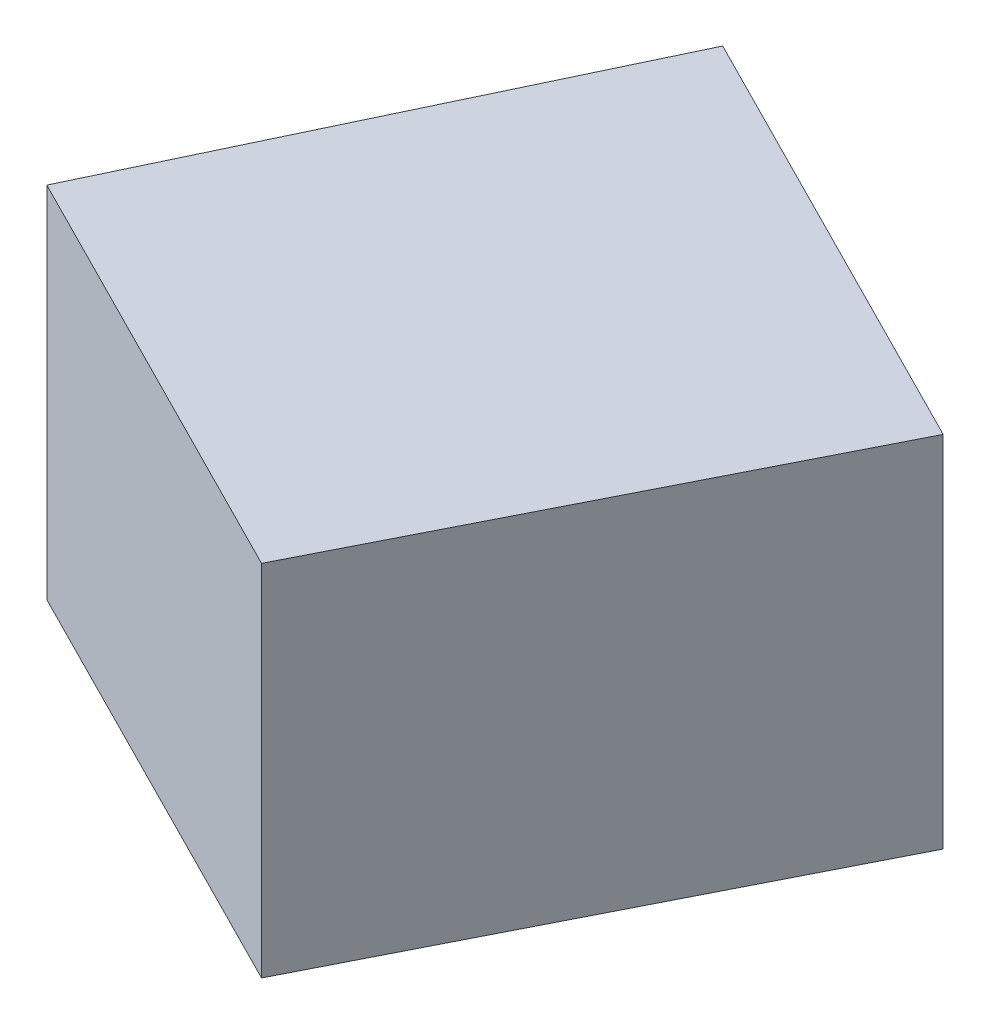
ISO-10303-21;
HEADER;
FILE_DESCRIPTION(('STEP AP214'),'2;1');
FILE_NAME('part.step','',(''),(''),'','','');
FILE_SCHEMA(('AUTOMOTIVE_DESIGN { 1 0 10303 214 1 1 1 1 }'));
ENDSEC;
DATA;
#1=APPLICATION_CONTEXT('core data for automotive mechanical design processes');
#2=APPLICATION_PROTOCOL_DEFINITION('international standard','automotive_design',2000,#1);
#3=PRODUCT_CONTEXT('',#1,'mechanical');
#4=PRODUCT('Part','Part','',(#3));
#5=PRODUCT_RELATED_PRODUCT_CATEGORY('part','',(#4));
#6=PRODUCT_DEFINITION_FORMATION('','',#4);
#7=PRODUCT_DEFINITION_CONTEXT('part definition',#1,'design');
#8=PRODUCT_DEFINITION('design','',#6,#7);
#9=PRODUCT_DEFINITION_SHAPE('','',#8);
#10=(LENGTH_UNIT() NAMED_UNIT(*) SI_UNIT(.MILLI.,.METRE.));
#11=(NAMED_UNIT(*) PLANE_ANGLE_UNIT() SI_UNIT($,.RADIAN.));
#12=(NAMED_UNIT(*) SI_UNIT($,.STERADIAN.) SOLID_ANGLE_UNIT());
#13=UNCERTAINTY_MEASURE_WITH_UNIT(LENGTH_MEASURE(1.E-05),#10,'distance_accuracy_value','');
#14=(GEOMETRIC_REPRESENTATION_CONTEXT(3) GLOBAL_UNCERTAINTY_ASSIGNED_CONTEXT((#13)) GLOBAL_UNIT_ASSIGNED_CONTEXT((#10,
#11,#12)) REPRESENTATION_CONTEXT('',''));
#15=CARTESIAN_POINT('',(0.,0.,0.));
#16=DIRECTION('',(0.,0.,1.));
#17=DIRECTION('',(1.,0.,0.));
#18=AXIS2_PLACEMENT_3D('',#15,#16,#17);
#19=CARTESIAN_POINT('',(-26.5347528052394,57.,-65.485903040052));
#20=DIRECTION('',(0.903480360145151,0.,0.428629488990186));
#21=DIRECTION('',(0.428629488990186,0.,-0.903480360145151));
#22=AXIS2_PLACEMENT_3D('',#19,#20,#21);
#23=PLANE('',#22);
#24=DIRECTION('',(-0.428629488990186,0.,0.903480360145151));
#25=VECTOR('',#24,1.);
#26=CARTESIAN_POINT('',(-26.5347528052394,0.,-65.485903040052));
#27=LINE('',#26,#25);
#28=CARTESIAN_POINT('',(-26.5347528052394,0.,-65.485903040052));
#29=VERTEX_POINT('',#28);
#30=CARTESIAN_POINT('',(-61.0565914846975,0.,7.28044655588945));
#31=VERTEX_POINT('',#30);
#32=EDGE_CURVE('E111',#29,#31,#27,.T.);
#33=ORIENTED_EDGE('',*,*,#32,.T.);
#34=DIRECTION('',(0.,-1.,0.));
#35=VECTOR('',#34,1.);
#36=CARTESIAN_POINT('',(-61.0565914846975,57.,7.28044655588945));
#37=LINE('',#36,#35);
#38=CARTESIAN_POINT('',(-61.0565914846975,57.,7.28044655588945));
#39=VERTEX_POINT('',#38);
#40=EDGE_CURVE('E11',#39,#31,#37,.T.);
#41=ORIENTED_EDGE('',*,*,#40,.F.);
#42=DIRECTION('',(-0.428629488990186,0.,0.903480360145151));
#43=VECTOR('',#42,1.);
#44=CARTESIAN_POINT('',(-26.5347528052394,57.,-65.485903040052));
#45=LINE('',#44,#43);
#46=CARTESIAN_POINT('',(-26.5347528052394,57.,-65.485903040052));
#47=VERTEX_POINT('',#46);
#48=EDGE_CURVE('E95',#47,#39,#45,.T.);
#49=ORIENTED_EDGE('',*,*,#48,.F.);
#50=DIRECTION('',(0.,-1.,0.));
#51=VECTOR('',#50,1.);
#52=CARTESIAN_POINT('',(-26.5347528052394,57.,-65.485903040052));
#53=LINE('',#52,#51);
#54=EDGE_CURVE('E107',#47,#29,#53,.T.);
#55=ORIENTED_EDGE('',*,*,#54,.T.);
#56=EDGE_LOOP('',(#33,#41,#49,#55));
#57=FACE_BOUND('',#56,.T.);
#58=ADVANCED_FACE('F43',(#57),#23,.F.);
#59=CARTESIAN_POINT('',(-61.0565914846975,57.,7.28044655588945));
#60=DIRECTION('',(0.451725143369731,0.,-0.892157158155219));
#61=DIRECTION('',(-0.892157158155219,0.,-0.451725143369731));
#62=AXIS2_PLACEMENT_3D('',#59,#60,#61);
#63=PLANE('',#62);
#64=DIRECTION('',(0.892157158155219,0.,0.451725143369731));
#65=VECTOR('',#64,1.);
#66=CARTESIAN_POINT('',(-61.0565914846975,0.,7.28044655588945));
#67=LINE('',#66,#65);
#68=CARTESIAN_POINT('',(7.9870858742185,0.,42.2392705350874));
#69=VERTEX_POINT('',#68);
#70=EDGE_CURVE('E100',#31,#69,#67,.T.);
#71=ORIENTED_EDGE('',*,*,#70,.T.);
#72=DIRECTION('',(0.,-1.,0.));
#73=VECTOR('',#72,1.);
#74=CARTESIAN_POINT('',(7.9870858742185,57.,42.2392705350874));
#75=LINE('',#74,#73);
#76=CARTESIAN_POINT('',(7.9870858742185,57.,42.2392705350874));
#77=VERTEX_POINT('',#76);
#78=EDGE_CURVE('E52',#77,#69,#75,.T.);
#79=ORIENTED_EDGE('',*,*,#78,.F.);
#80=DIRECTION('',(0.892157158155219,0.,0.451725143369731));
#81=VECTOR('',#80,1.);
#82=CARTESIAN_POINT('',(-61.0565914846975,57.,7.28044655588945));
#83=LINE('',#82,#81);
#84=EDGE_CURVE('E90',#39,#77,#83,.T.);
#85=ORIENTED_EDGE('',*,*,#84,.F.);
#86=ORIENTED_EDGE('',*,*,#40,.T.);
#87=EDGE_LOOP('',(#71,#79,#85,#86));
#88=FACE_BOUND('',#87,.T.);
#89=ADVANCED_FACE('F99',(#88),#63,.F.);
#90=CARTESIAN_POINT('',(7.9870858742185,57.,42.2392705350874));
#91=DIRECTION('',(-0.892157158155218,0.,-0.451725143369731));
#92=DIRECTION('',(-0.451725143369731,0.,0.892157158155219));
#93=AXIS2_PLACEMENT_3D('',#90,#91,#92);
#94=PLANE('',#93);
#95=DIRECTION('',(0.451725143369731,0.,-0.892157158155218));
#96=VECTOR('',#95,1.);
#97=CARTESIAN_POINT('',(7.9870858742185,0.,42.2392705350874));
#98=LINE('',#97,#96);
#99=CARTESIAN_POINT('',(44.3570140224531,0.,-29.5913375576759));
#100=VERTEX_POINT('',#99);
#101=EDGE_CURVE('E77',#69,#100,#98,.T.);
#102=ORIENTED_EDGE('',*,*,#101,.T.);
#103=DIRECTION('',(0.,-1.,0.));
#104=VECTOR('',#103,1.);
#105=CARTESIAN_POINT('',(44.3570140224531,57.,-29.5913375576759));
#106=LINE('',#105,#104);
#107=CARTESIAN_POINT('',(44.3570140224531,57.,-29.5913375576759));
#108=VERTEX_POINT('',#107);
#109=EDGE_CURVE('E102',#108,#100,#106,.T.);
#110=ORIENTED_EDGE('',*,*,#109,.F.);
#111=DIRECTION('',(0.451725143369731,0.,-0.892157158155218));
#112=VECTOR('',#111,1.);
#113=CARTESIAN_POINT('',(7.9870858742185,57.,42.2392705350874));
#114=LINE('',#113,#112);
#115=EDGE_CURVE('E93',#77,#108,#114,.T.);
#116=ORIENTED_EDGE('',*,*,#115,.F.);
#117=ORIENTED_EDGE('',*,*,#78,.T.);
#118=EDGE_LOOP('',(#102,#110,#116,#117));
#119=FACE_BOUND('',#118,.T.);
#120=ADVANCED_FACE('F103',(#119),#94,.F.);
#121=CARTESIAN_POINT('',(44.3570140224531,57.,-29.5913375576759));
#122=DIRECTION('',(-0.451725143369732,0.,0.892157158155218));
#123=DIRECTION('',(0.892157158155218,0.,0.451725143369732));
#124=AXIS2_PLACEMENT_3D('',#121,#122,#123);
#125=PLANE('',#124);
#126=DIRECTION('',(-0.892157158155218,0.,-0.451725143369732));
#127=VECTOR('',#126,1.);
#128=CARTESIAN_POINT('',(44.3570140224531,0.,-29.5913375576759));
#129=LINE('',#128,#127);
#130=EDGE_CURVE('E83',#100,#29,#129,.T.);
#131=ORIENTED_EDGE('',*,*,#130,.T.);
#132=ORIENTED_EDGE('',*,*,#54,.F.);
#133=DIRECTION('',(-0.892157158155218,0.,-0.451725143369732));
#134=VECTOR('',#133,1.);
#135=CARTESIAN_POINT('',(44.3570140224531,57.,-29.5913375576759));
#136=LINE('',#135,#134);
#137=EDGE_CURVE('E60',#108,#47,#136,.T.);
#138=ORIENTED_EDGE('',*,*,#137,.F.);
#139=ORIENTED_EDGE('',*,*,#109,.T.);
#140=EDGE_LOOP('',(#131,#132,#138,#139));
#141=FACE_BOUND('',#140,.T.);
#142=ADVANCED_FACE('F124',(#141),#125,.F.);
#143=CARTESIAN_POINT('',(0.,57.,0.));
#144=DIRECTION('',(0.,1.,0.));
#145=DIRECTION('',(0.,0.,1.));
#146=AXIS2_PLACEMENT_3D('',#143,#144,#145);
#147=PLANE('',#146);
#148=ORIENTED_EDGE('',*,*,#48,.T.);
#149=ORIENTED_EDGE('',*,*,#84,.T.);
#150=ORIENTED_EDGE('',*,*,#115,.T.);
#151=ORIENTED_EDGE('',*,*,#137,.T.);
#152=EDGE_LOOP('',(#148,#149,#150,#151));
#153=FACE_BOUND('',#152,.T.);
#154=ADVANCED_FACE('F91',(#153),#147,.T.);
#155=CARTESIAN_POINT('',(0.,0.,0.));
#156=DIRECTION('',(0.,1.,0.));
#157=DIRECTION('',(0.,0.,1.));
#158=AXIS2_PLACEMENT_3D('',#155,#156,#157);
#159=PLANE('',#158);
#160=ORIENTED_EDGE('',*,*,#32,.F.);
#161=ORIENTED_EDGE('',*,*,#130,.F.);
#162=ORIENTED_EDGE('',*,*,#101,.F.);
#163=ORIENTED_EDGE('',*,*,#70,.F.);
#164=EDGE_LOOP('',(#160,#161,#162,#163));
#165=FACE_BOUND('',#164,.T.);
#166=ADVANCED_FACE('F127',(#165),#159,.F.);
#167=CLOSED_SHELL('',(#58,#89,#120,#142,#154,#166));
#168=MANIFOLD_SOLID_BREP('B2',#167);
#169=ADVANCED_BREP_SHAPE_REPRESENTATION('',(#18,#168),#14);
#170=SHAPE_DEFINITION_REPRESENTATION(#9,#169);
ENDSEC;
END-ISO-10303-21;
